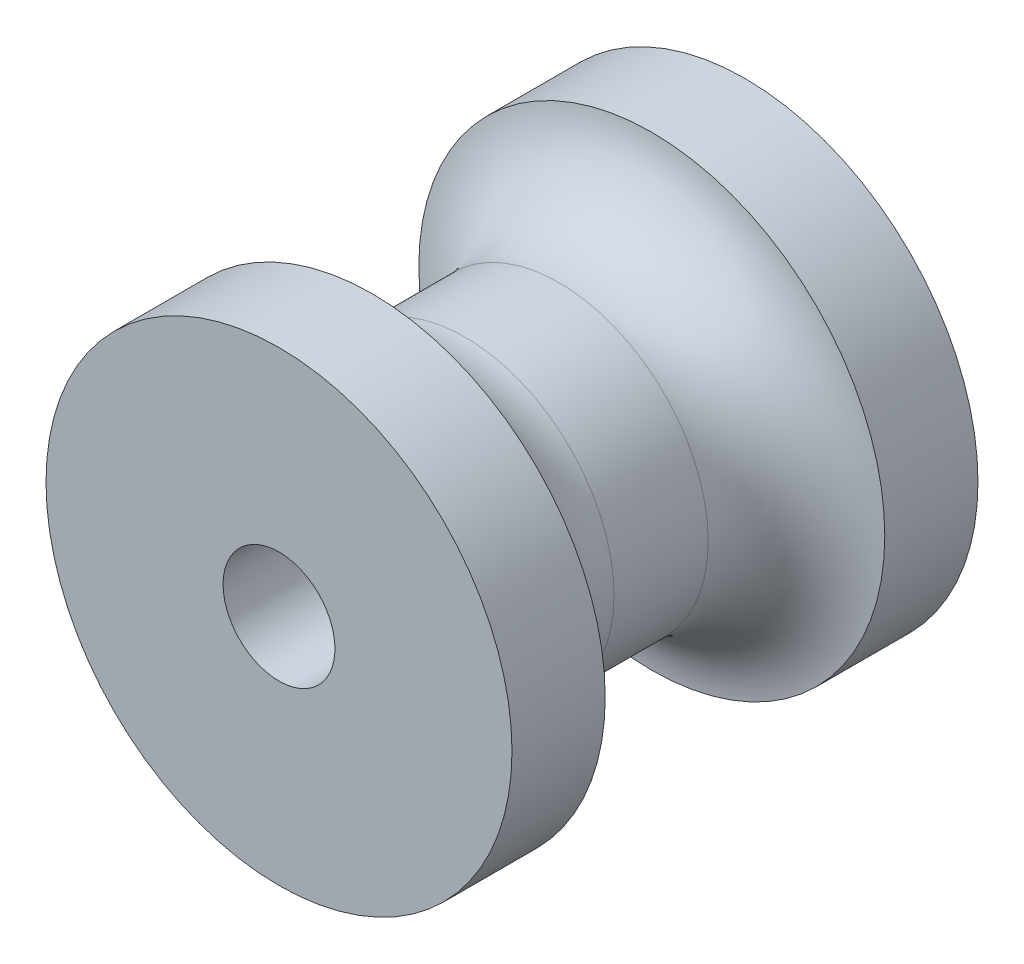
ISO-10303-21;
HEADER;
FILE_DESCRIPTION(('STEP AP214'),'2;1');
FILE_NAME('part.step','',(''),(''),'','','');
FILE_SCHEMA(('AUTOMOTIVE_DESIGN { 1 0 10303 214 1 1 1 1 }'));
ENDSEC;
DATA;
#1=APPLICATION_CONTEXT('core data for automotive mechanical design processes');
#2=APPLICATION_PROTOCOL_DEFINITION('international standard','automotive_design',2000,#1);
#3=PRODUCT_CONTEXT('',#1,'mechanical');
#4=PRODUCT('Part','Part','',(#3));
#5=PRODUCT_RELATED_PRODUCT_CATEGORY('part','',(#4));
#6=PRODUCT_DEFINITION_FORMATION('','',#4);
#7=PRODUCT_DEFINITION_CONTEXT('part definition',#1,'design');
#8=PRODUCT_DEFINITION('design','',#6,#7);
#9=PRODUCT_DEFINITION_SHAPE('','',#8);
#10=(LENGTH_UNIT() NAMED_UNIT(*) SI_UNIT(.MILLI.,.METRE.));
#11=(NAMED_UNIT(*) PLANE_ANGLE_UNIT() SI_UNIT($,.RADIAN.));
#12=(NAMED_UNIT(*) SI_UNIT($,.STERADIAN.) SOLID_ANGLE_UNIT());
#13=UNCERTAINTY_MEASURE_WITH_UNIT(LENGTH_MEASURE(1.E-05),#10,'distance_accuracy_value','');
#14=(GEOMETRIC_REPRESENTATION_CONTEXT(3) GLOBAL_UNCERTAINTY_ASSIGNED_CONTEXT((#13)) GLOBAL_UNIT_ASSIGNED_CONTEXT((#10,
#11,#12)) REPRESENTATION_CONTEXT('',''));
#15=CARTESIAN_POINT('',(0.,0.,0.));
#16=DIRECTION('',(0.,0.,1.));
#17=DIRECTION('',(1.,0.,0.));
#18=AXIS2_PLACEMENT_3D('',#15,#16,#17);
#19=CARTESIAN_POINT('',(0.,0.,0.));
#20=DIRECTION('',(0.,0.,-1.));
#21=DIRECTION('',(-1.,0.,0.));
#22=AXIS2_PLACEMENT_3D('',#19,#20,#21);
#23=CYLINDRICAL_SURFACE('',#22,6.35);
#24=CARTESIAN_POINT('',(0.,0.,2.54));
#25=DIRECTION('',(0.,0.,-1.));
#26=DIRECTION('',(-1.,0.,0.));
#27=AXIS2_PLACEMENT_3D('',#24,#25,#26);
#28=CIRCLE('',#27,6.35);
#29=CARTESIAN_POINT('',(-6.35,0.,2.54));
#30=VERTEX_POINT('',#29);
#31=EDGE_CURVE('E56',#30,#30,#28,.T.);
#32=ORIENTED_EDGE('',*,*,#31,.T.);
#33=EDGE_LOOP('',(#32));
#34=FACE_BOUND('',#33,.T.);
#35=CARTESIAN_POINT('',(0.,0.,0.));
#36=DIRECTION('',(0.,0.,-1.));
#37=DIRECTION('',(-1.,0.,0.));
#38=AXIS2_PLACEMENT_3D('',#35,#36,#37);
#39=CIRCLE('',#38,6.35);
#40=CARTESIAN_POINT('',(-6.35,0.,0.));
#41=VERTEX_POINT('',#40);
#42=EDGE_CURVE('E79',#41,#41,#39,.T.);
#43=ORIENTED_EDGE('',*,*,#42,.F.);
#44=EDGE_LOOP('',(#43));
#45=FACE_BOUND('',#44,.T.);
#46=ADVANCED_FACE('F43',(#34,#45),#23,.T.);
#47=CARTESIAN_POINT('',(0.,0.,0.));
#48=DIRECTION('',(0.,0.,-1.));
#49=DIRECTION('',(-1.,0.,0.));
#50=AXIS2_PLACEMENT_3D('',#47,#48,#49);
#51=CYLINDRICAL_SURFACE('',#50,4.064);
#52=CARTESIAN_POINT('',(0.,0.,5.06726809025081));
#53=DIRECTION('',(0.,0.,-1.));
#54=DIRECTION('',(-1.,0.,0.));
#55=AXIS2_PLACEMENT_3D('',#52,#53,#54);
#56=CIRCLE('',#55,4.064);
#57=CARTESIAN_POINT('',(-4.064,0.,5.06726809025081));
#58=VERTEX_POINT('',#57);
#59=EDGE_CURVE('E10',#58,#58,#56,.F.);
#60=ORIENTED_EDGE('',*,*,#59,.T.);
#61=EDGE_LOOP('',(#60));
#62=FACE_BOUND('',#61,.T.);
#63=CARTESIAN_POINT('',(0.,0.,7.63273190974918));
#64=DIRECTION('',(0.,0.,1.));
#65=DIRECTION('',(1.,0.,0.));
#66=AXIS2_PLACEMENT_3D('',#63,#64,#65);
#67=CIRCLE('',#66,4.064);
#68=CARTESIAN_POINT('',(4.064,0.,7.63273190974918));
#69=VERTEX_POINT('',#68);
#70=EDGE_CURVE('E51',#69,#69,#67,.F.);
#71=ORIENTED_EDGE('',*,*,#70,.T.);
#72=EDGE_LOOP('',(#71));
#73=FACE_BOUND('',#72,.T.);
#74=ADVANCED_FACE('F88',(#62,#73),#51,.T.);
#75=CARTESIAN_POINT('',(0.,0.,0.));
#76=DIRECTION('',(0.,0.,-1.));
#77=DIRECTION('',(-1.,0.,0.));
#78=AXIS2_PLACEMENT_3D('',#75,#76,#77);
#79=CYLINDRICAL_SURFACE('',#78,6.35);
#80=CARTESIAN_POINT('',(0.,0.,12.7));
#81=DIRECTION('',(0.,0.,-1.));
#82=DIRECTION('',(-1.,0.,0.));
#83=AXIS2_PLACEMENT_3D('',#80,#81,#82);
#84=CIRCLE('',#83,6.35);
#85=CARTESIAN_POINT('',(-6.35,0.,12.7));
#86=VERTEX_POINT('',#85);
#87=EDGE_CURVE('E67',#86,#86,#84,.T.);
#88=ORIENTED_EDGE('',*,*,#87,.T.);
#89=EDGE_LOOP('',(#88));
#90=FACE_BOUND('',#89,.T.);
#91=CARTESIAN_POINT('',(0.,0.,10.16));
#92=DIRECTION('',(0.,0.,-1.));
#93=DIRECTION('',(-1.,0.,0.));
#94=AXIS2_PLACEMENT_3D('',#91,#92,#93);
#95=CIRCLE('',#94,6.35);
#96=CARTESIAN_POINT('',(-6.35,0.,10.16));
#97=VERTEX_POINT('',#96);
#98=EDGE_CURVE('E61',#97,#97,#95,.T.);
#99=ORIENTED_EDGE('',*,*,#98,.F.);
#100=EDGE_LOOP('',(#99));
#101=FACE_BOUND('',#100,.T.);
#102=ADVANCED_FACE('F95',(#90,#101),#79,.T.);
#103=CARTESIAN_POINT('',(0.,6.35,12.7));
#104=DIRECTION('',(0.,0.,1.));
#105=DIRECTION('',(1.,0.,0.));
#106=AXIS2_PLACEMENT_3D('',#103,#104,#105);
#107=PLANE('',#106);
#108=CARTESIAN_POINT('',(0.,0.,12.7));
#109=DIRECTION('',(0.,0.,-1.));
#110=DIRECTION('',(-1.,0.,0.));
#111=AXIS2_PLACEMENT_3D('',#108,#109,#110);
#112=CIRCLE('',#111,1.524);
#113=CARTESIAN_POINT('',(-1.524,0.,12.7));
#114=VERTEX_POINT('',#113);
#115=EDGE_CURVE('E71',#114,#114,#112,.T.);
#116=ORIENTED_EDGE('',*,*,#115,.T.);
#117=EDGE_LOOP('',(#116));
#118=FACE_BOUND('',#117,.T.);
#119=ORIENTED_EDGE('',*,*,#87,.F.);
#120=EDGE_LOOP('',(#119));
#121=FACE_BOUND('',#120,.T.);
#122=ADVANCED_FACE('F113',(#118,#121),#107,.T.);
#123=CARTESIAN_POINT('',(0.,0.,0.));
#124=DIRECTION('',(0.,0.,-1.));
#125=DIRECTION('',(-1.,0.,0.));
#126=AXIS2_PLACEMENT_3D('',#123,#124,#125);
#127=CYLINDRICAL_SURFACE('',#126,1.524);
#128=CARTESIAN_POINT('',(0.,0.,0.));
#129=DIRECTION('',(0.,0.,-1.));
#130=DIRECTION('',(-1.,0.,0.));
#131=AXIS2_PLACEMENT_3D('',#128,#129,#130);
#132=CIRCLE('',#131,1.524);
#133=CARTESIAN_POINT('',(-1.524,0.,0.));
#134=VERTEX_POINT('',#133);
#135=EDGE_CURVE('E75',#134,#134,#132,.T.);
#136=ORIENTED_EDGE('',*,*,#135,.T.);
#137=EDGE_LOOP('',(#136));
#138=FACE_BOUND('',#137,.T.);
#139=ORIENTED_EDGE('',*,*,#115,.F.);
#140=EDGE_LOOP('',(#139));
#141=FACE_BOUND('',#140,.T.);
#142=ADVANCED_FACE('F106',(#138,#141),#127,.F.);
#143=CARTESIAN_POINT('',(0.,6.35,0.));
#144=DIRECTION('',(0.,0.,-1.));
#145=DIRECTION('',(-1.,0.,0.));
#146=AXIS2_PLACEMENT_3D('',#143,#144,#145);
#147=PLANE('',#146);
#148=ORIENTED_EDGE('',*,*,#42,.T.);
#149=EDGE_LOOP('',(#148));
#150=FACE_BOUND('',#149,.T.);
#151=ORIENTED_EDGE('',*,*,#135,.F.);
#152=EDGE_LOOP('',(#151));
#153=FACE_BOUND('',#152,.T.);
#154=ADVANCED_FACE('F84',(#150,#153),#147,.T.);
#155=CARTESIAN_POINT('',(0.,0.,5.06726809025081));
#156=DIRECTION('',(0.,0.,-1.));
#157=DIRECTION('',(-1.,0.,0.));
#158=AXIS2_PLACEMENT_3D('',#155,#156,#157);
#159=TOROIDAL_SURFACE('',#158,6.604,2.54);
#160=ORIENTED_EDGE('',*,*,#59,.F.);
#161=EDGE_LOOP('',(#160));
#162=FACE_BOUND('',#161,.T.);
#163=ORIENTED_EDGE('',*,*,#31,.F.);
#164=EDGE_LOOP('',(#163));
#165=FACE_BOUND('',#164,.T.);
#166=ADVANCED_FACE('F98',(#162,#165),#159,.F.);
#167=CARTESIAN_POINT('',(0.,0.,7.63273190974918));
#168=DIRECTION('',(0.,0.,1.));
#169=DIRECTION('',(1.,0.,0.));
#170=AXIS2_PLACEMENT_3D('',#167,#168,#169);
#171=TOROIDAL_SURFACE('',#170,6.604,2.54);
#172=ORIENTED_EDGE('',*,*,#98,.T.);
#173=EDGE_LOOP('',(#172));
#174=FACE_BOUND('',#173,.T.);
#175=ORIENTED_EDGE('',*,*,#70,.F.);
#176=EDGE_LOOP('',(#175));
#177=FACE_BOUND('',#176,.T.);
#178=ADVANCED_FACE('F45',(#174,#177),#171,.F.);
#179=CLOSED_SHELL('',(#46,#74,#102,#122,#142,#154,#166,#178));
#180=MANIFOLD_SOLID_BREP('B2',#179);
#181=ADVANCED_BREP_SHAPE_REPRESENTATION('',(#18,#180),#14);
#182=SHAPE_DEFINITION_REPRESENTATION(#9,#181);
ENDSEC;
END-ISO-10303-21;
